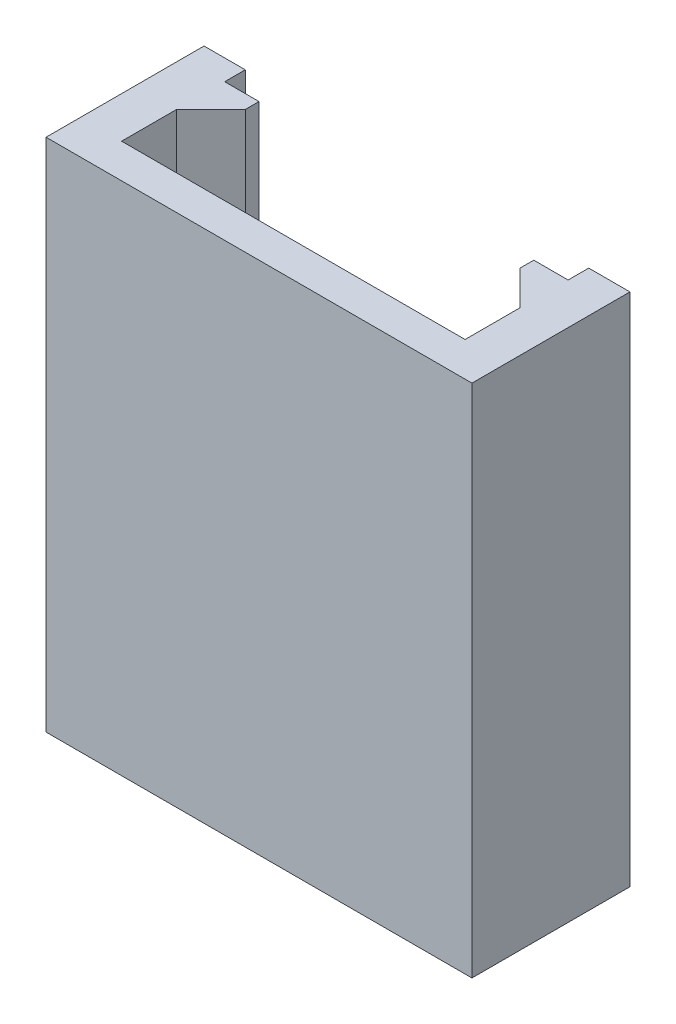
ISO-10303-21;
HEADER;
FILE_DESCRIPTION(('STEP AP214'),'2;1');
FILE_NAME('part.step','',(''),(''),'','','');
FILE_SCHEMA(('AUTOMOTIVE_DESIGN { 1 0 10303 214 1 1 1 1 }'));
ENDSEC;
DATA;
#1=APPLICATION_CONTEXT('core data for automotive mechanical design processes');
#2=APPLICATION_PROTOCOL_DEFINITION('international standard','automotive_design',2000,#1);
#3=PRODUCT_CONTEXT('',#1,'mechanical');
#4=PRODUCT('Part','Part','',(#3));
#5=PRODUCT_RELATED_PRODUCT_CATEGORY('part','',(#4));
#6=PRODUCT_DEFINITION_FORMATION('','',#4);
#7=PRODUCT_DEFINITION_CONTEXT('part definition',#1,'design');
#8=PRODUCT_DEFINITION('design','',#6,#7);
#9=PRODUCT_DEFINITION_SHAPE('','',#8);
#10=(LENGTH_UNIT() NAMED_UNIT(*) SI_UNIT(.MILLI.,.METRE.));
#11=(NAMED_UNIT(*) PLANE_ANGLE_UNIT() SI_UNIT($,.RADIAN.));
#12=(NAMED_UNIT(*) SI_UNIT($,.STERADIAN.) SOLID_ANGLE_UNIT());
#13=UNCERTAINTY_MEASURE_WITH_UNIT(LENGTH_MEASURE(1.E-05),#10,'distance_accuracy_value','');
#14=(GEOMETRIC_REPRESENTATION_CONTEXT(3) GLOBAL_UNCERTAINTY_ASSIGNED_CONTEXT((#13)) GLOBAL_UNIT_ASSIGNED_CONTEXT((#10,
#11,#12)) REPRESENTATION_CONTEXT('',''));
#15=CARTESIAN_POINT('',(0.,0.,0.));
#16=DIRECTION('',(0.,0.,1.));
#17=DIRECTION('',(1.,0.,0.));
#18=AXIS2_PLACEMENT_3D('',#15,#16,#17);
#19=CARTESIAN_POINT('',(-5.,15.,0.));
#20=DIRECTION('',(-1.,0.,0.));
#21=DIRECTION('',(0.,0.,1.));
#22=AXIS2_PLACEMENT_3D('',#19,#20,#21);
#23=PLANE('',#22);
#24=DIRECTION('',(0.,0.,-1.));
#25=VECTOR('',#24,1.);
#26=CARTESIAN_POINT('',(-5.,0.,0.));
#27=LINE('',#26,#25);
#28=CARTESIAN_POINT('',(-5.,0.,0.));
#29=VERTEX_POINT('',#28);
#30=CARTESIAN_POINT('',(-5.,0.,-1.6));
#31=VERTEX_POINT('',#30);
#32=EDGE_CURVE('E177',#29,#31,#27,.T.);
#33=ORIENTED_EDGE('',*,*,#32,.T.);
#34=DIRECTION('',(0.,-1.,0.));
#35=VECTOR('',#34,1.);
#36=CARTESIAN_POINT('',(-5.,15.,-1.6));
#37=LINE('',#36,#35);
#38=CARTESIAN_POINT('',(-5.,15.,-1.6));
#39=VERTEX_POINT('',#38);
#40=EDGE_CURVE('E11',#39,#31,#37,.T.);
#41=ORIENTED_EDGE('',*,*,#40,.F.);
#42=DIRECTION('',(0.,0.,-1.));
#43=VECTOR('',#42,1.);
#44=CARTESIAN_POINT('',(-5.,15.,0.));
#45=LINE('',#44,#43);
#46=CARTESIAN_POINT('',(-5.,15.,0.));
#47=VERTEX_POINT('',#46);
#48=EDGE_CURVE('E207',#47,#39,#45,.T.);
#49=ORIENTED_EDGE('',*,*,#48,.F.);
#50=DIRECTION('',(0.,-1.,0.));
#51=VECTOR('',#50,1.);
#52=CARTESIAN_POINT('',(-5.,15.,0.));
#53=LINE('',#52,#51);
#54=EDGE_CURVE('E173',#47,#29,#53,.T.);
#55=ORIENTED_EDGE('',*,*,#54,.T.);
#56=EDGE_LOOP('',(#33,#41,#49,#55));
#57=FACE_BOUND('',#56,.T.);
#58=ADVANCED_FACE('F33',(#57),#23,.F.);
#59=CARTESIAN_POINT('',(-5.,15.,-1.6));
#60=DIRECTION('',(-0.707106781186547,0.,-0.707106781186548));
#61=DIRECTION('',(-0.707106781186548,0.,0.707106781186547));
#62=AXIS2_PLACEMENT_3D('',#59,#60,#61);
#63=PLANE('',#62);
#64=DIRECTION('',(0.707106781186548,0.,-0.707106781186548));
#65=VECTOR('',#64,1.);
#66=CARTESIAN_POINT('',(-5.,0.,-1.6));
#67=LINE('',#66,#65);
#68=CARTESIAN_POINT('',(-4.,0.,-2.6));
#69=VERTEX_POINT('',#68);
#70=EDGE_CURVE('E180',#31,#69,#67,.T.);
#71=ORIENTED_EDGE('',*,*,#70,.T.);
#72=DIRECTION('',(0.,-1.,0.));
#73=VECTOR('',#72,1.);
#74=CARTESIAN_POINT('',(-4.,15.,-2.6));
#75=LINE('',#74,#73);
#76=CARTESIAN_POINT('',(-4.,15.,-2.6));
#77=VERTEX_POINT('',#76);
#78=EDGE_CURVE('E41',#77,#69,#75,.T.);
#79=ORIENTED_EDGE('',*,*,#78,.F.);
#80=DIRECTION('',(0.707106781186548,0.,-0.707106781186548));
#81=VECTOR('',#80,1.);
#82=CARTESIAN_POINT('',(-5.,15.,-1.6));
#83=LINE('',#82,#81);
#84=EDGE_CURVE('E116',#39,#77,#83,.T.);
#85=ORIENTED_EDGE('',*,*,#84,.F.);
#86=ORIENTED_EDGE('',*,*,#40,.T.);
#87=EDGE_LOOP('',(#71,#79,#85,#86));
#88=FACE_BOUND('',#87,.T.);
#89=ADVANCED_FACE('F305',(#88),#63,.F.);
#90=CARTESIAN_POINT('',(-4.,15.,-2.6));
#91=DIRECTION('',(-1.,0.,0.));
#92=DIRECTION('',(0.,0.,1.));
#93=AXIS2_PLACEMENT_3D('',#90,#91,#92);
#94=PLANE('',#93);
#95=DIRECTION('',(0.,0.,-1.));
#96=VECTOR('',#95,1.);
#97=CARTESIAN_POINT('',(-4.,0.,-2.6));
#98=LINE('',#97,#96);
#99=CARTESIAN_POINT('',(-4.,0.,-3.));
#100=VERTEX_POINT('',#99);
#101=EDGE_CURVE('E182',#69,#100,#98,.T.);
#102=ORIENTED_EDGE('',*,*,#101,.T.);
#103=DIRECTION('',(0.,-1.,0.));
#104=VECTOR('',#103,1.);
#105=CARTESIAN_POINT('',(-4.,15.,-3.));
#106=LINE('',#105,#104);
#107=CARTESIAN_POINT('',(-4.,15.,-3.));
#108=VERTEX_POINT('',#107);
#109=EDGE_CURVE('E238',#108,#100,#106,.T.);
#110=ORIENTED_EDGE('',*,*,#109,.F.);
#111=DIRECTION('',(0.,0.,-1.));
#112=VECTOR('',#111,1.);
#113=CARTESIAN_POINT('',(-4.,15.,-2.6));
#114=LINE('',#113,#112);
#115=EDGE_CURVE('E246',#77,#108,#114,.T.);
#116=ORIENTED_EDGE('',*,*,#115,.F.);
#117=ORIENTED_EDGE('',*,*,#78,.T.);
#118=EDGE_LOOP('',(#102,#110,#116,#117));
#119=FACE_BOUND('',#118,.T.);
#120=ADVANCED_FACE('F244',(#119),#94,.F.);
#121=CARTESIAN_POINT('',(-4.,15.,-3.));
#122=DIRECTION('',(0.,0.,1.));
#123=DIRECTION('',(1.,0.,0.));
#124=AXIS2_PLACEMENT_3D('',#121,#122,#123);
#125=PLANE('',#124);
#126=DIRECTION('',(-1.,0.,0.));
#127=VECTOR('',#126,1.);
#128=CARTESIAN_POINT('',(-4.,0.,-3.));
#129=LINE('',#128,#127);
#130=CARTESIAN_POINT('',(-5.,0.,-3.));
#131=VERTEX_POINT('',#130);
#132=EDGE_CURVE('E184',#100,#131,#129,.T.);
#133=ORIENTED_EDGE('',*,*,#132,.T.);
#134=DIRECTION('',(0.,-1.,0.));
#135=VECTOR('',#134,1.);
#136=CARTESIAN_POINT('',(-5.,15.,-3.));
#137=LINE('',#136,#135);
#138=CARTESIAN_POINT('',(-5.,15.,-3.));
#139=VERTEX_POINT('',#138);
#140=EDGE_CURVE('E235',#139,#131,#137,.T.);
#141=ORIENTED_EDGE('',*,*,#140,.F.);
#142=DIRECTION('',(-1.,0.,0.));
#143=VECTOR('',#142,1.);
#144=CARTESIAN_POINT('',(-4.,15.,-3.));
#145=LINE('',#144,#143);
#146=EDGE_CURVE('E264',#108,#139,#145,.T.);
#147=ORIENTED_EDGE('',*,*,#146,.F.);
#148=ORIENTED_EDGE('',*,*,#109,.T.);
#149=EDGE_LOOP('',(#133,#141,#147,#148));
#150=FACE_BOUND('',#149,.T.);
#151=ADVANCED_FACE('F255',(#150),#125,.F.);
#152=CARTESIAN_POINT('',(-5.,15.,-3.));
#153=DIRECTION('',(-1.,0.,0.));
#154=DIRECTION('',(0.,0.,1.));
#155=AXIS2_PLACEMENT_3D('',#152,#153,#154);
#156=PLANE('',#155);
#157=DIRECTION('',(0.,0.,-1.));
#158=VECTOR('',#157,1.);
#159=CARTESIAN_POINT('',(-5.,0.,-3.));
#160=LINE('',#159,#158);
#161=CARTESIAN_POINT('',(-5.,0.,-3.6));
#162=VERTEX_POINT('',#161);
#163=EDGE_CURVE('E186',#131,#162,#160,.T.);
#164=ORIENTED_EDGE('',*,*,#163,.T.);
#165=DIRECTION('',(0.,-1.,0.));
#166=VECTOR('',#165,1.);
#167=CARTESIAN_POINT('',(-5.,15.,-3.6));
#168=LINE('',#167,#166);
#169=CARTESIAN_POINT('',(-5.,15.,-3.6));
#170=VERTEX_POINT('',#169);
#171=EDGE_CURVE('E232',#170,#162,#168,.T.);
#172=ORIENTED_EDGE('',*,*,#171,.F.);
#173=DIRECTION('',(0.,0.,-1.));
#174=VECTOR('',#173,1.);
#175=CARTESIAN_POINT('',(-5.,15.,-3.));
#176=LINE('',#175,#174);
#177=EDGE_CURVE('E261',#139,#170,#176,.T.);
#178=ORIENTED_EDGE('',*,*,#177,.F.);
#179=ORIENTED_EDGE('',*,*,#140,.T.);
#180=EDGE_LOOP('',(#164,#172,#178,#179));
#181=FACE_BOUND('',#180,.T.);
#182=ADVANCED_FACE('F259',(#181),#156,.F.);
#183=CARTESIAN_POINT('',(-5.,15.,-3.6));
#184=DIRECTION('',(0.,0.,1.));
#185=DIRECTION('',(1.,0.,0.));
#186=AXIS2_PLACEMENT_3D('',#183,#184,#185);
#187=PLANE('',#186);
#188=DIRECTION('',(-1.,0.,0.));
#189=VECTOR('',#188,1.);
#190=CARTESIAN_POINT('',(-5.,0.,-3.6));
#191=LINE('',#190,#189);
#192=CARTESIAN_POINT('',(-6.2,0.,-3.6));
#193=VERTEX_POINT('',#192);
#194=EDGE_CURVE('E188',#162,#193,#191,.T.);
#195=ORIENTED_EDGE('',*,*,#194,.T.);
#196=DIRECTION('',(0.,-1.,0.));
#197=VECTOR('',#196,1.);
#198=CARTESIAN_POINT('',(-6.2,15.,-3.6));
#199=LINE('',#198,#197);
#200=CARTESIAN_POINT('',(-6.2,15.,-3.6));
#201=VERTEX_POINT('',#200);
#202=EDGE_CURVE('E229',#201,#193,#199,.T.);
#203=ORIENTED_EDGE('',*,*,#202,.F.);
#204=DIRECTION('',(-1.,0.,0.));
#205=VECTOR('',#204,1.);
#206=CARTESIAN_POINT('',(-5.,15.,-3.6));
#207=LINE('',#206,#205);
#208=EDGE_CURVE('E263',#170,#201,#207,.T.);
#209=ORIENTED_EDGE('',*,*,#208,.F.);
#210=ORIENTED_EDGE('',*,*,#171,.T.);
#211=EDGE_LOOP('',(#195,#203,#209,#210));
#212=FACE_BOUND('',#211,.T.);
#213=ADVANCED_FACE('F318',(#212),#187,.F.);
#214=CARTESIAN_POINT('',(-6.2,15.,-3.6));
#215=DIRECTION('',(1.,0.,0.));
#216=DIRECTION('',(0.,0.,-1.));
#217=AXIS2_PLACEMENT_3D('',#214,#215,#216);
#218=PLANE('',#217);
#219=DIRECTION('',(0.,0.,1.));
#220=VECTOR('',#219,1.);
#221=CARTESIAN_POINT('',(-6.2,0.,-3.6));
#222=LINE('',#221,#220);
#223=CARTESIAN_POINT('',(-6.2,0.,1.));
#224=VERTEX_POINT('',#223);
#225=EDGE_CURVE('E190',#193,#224,#222,.T.);
#226=ORIENTED_EDGE('',*,*,#225,.T.);
#227=DIRECTION('',(0.,-1.,0.));
#228=VECTOR('',#227,1.);
#229=CARTESIAN_POINT('',(-6.2,15.,1.));
#230=LINE('',#229,#228);
#231=CARTESIAN_POINT('',(-6.2,15.,1.));
#232=VERTEX_POINT('',#231);
#233=EDGE_CURVE('E226',#232,#224,#230,.T.);
#234=ORIENTED_EDGE('',*,*,#233,.F.);
#235=DIRECTION('',(0.,0.,1.));
#236=VECTOR('',#235,1.);
#237=CARTESIAN_POINT('',(-6.2,15.,-3.6));
#238=LINE('',#237,#236);
#239=EDGE_CURVE('E266',#201,#232,#238,.T.);
#240=ORIENTED_EDGE('',*,*,#239,.F.);
#241=ORIENTED_EDGE('',*,*,#202,.T.);
#242=EDGE_LOOP('',(#226,#234,#240,#241));
#243=FACE_BOUND('',#242,.T.);
#244=ADVANCED_FACE('F321',(#243),#218,.F.);
#245=CARTESIAN_POINT('',(-6.2,15.,1.));
#246=DIRECTION('',(0.,0.,-1.));
#247=DIRECTION('',(-1.,0.,0.));
#248=AXIS2_PLACEMENT_3D('',#245,#246,#247);
#249=PLANE('',#248);
#250=DIRECTION('',(1.,0.,0.));
#251=VECTOR('',#250,1.);
#252=CARTESIAN_POINT('',(-6.2,0.,1.));
#253=LINE('',#252,#251);
#254=CARTESIAN_POINT('',(6.20000000000001,0.,1.));
#255=VERTEX_POINT('',#254);
#256=EDGE_CURVE('E192',#224,#255,#253,.T.);
#257=ORIENTED_EDGE('',*,*,#256,.T.);
#258=DIRECTION('',(0.,-1.,0.));
#259=VECTOR('',#258,1.);
#260=CARTESIAN_POINT('',(6.20000000000001,15.,1.));
#261=LINE('',#260,#259);
#262=CARTESIAN_POINT('',(6.20000000000001,15.,1.));
#263=VERTEX_POINT('',#262);
#264=EDGE_CURVE('E223',#263,#255,#261,.T.);
#265=ORIENTED_EDGE('',*,*,#264,.F.);
#266=DIRECTION('',(1.,0.,0.));
#267=VECTOR('',#266,1.);
#268=CARTESIAN_POINT('',(-6.2,15.,1.));
#269=LINE('',#268,#267);
#270=EDGE_CURVE('E272',#232,#263,#269,.T.);
#271=ORIENTED_EDGE('',*,*,#270,.F.);
#272=ORIENTED_EDGE('',*,*,#233,.T.);
#273=EDGE_LOOP('',(#257,#265,#271,#272));
#274=FACE_BOUND('',#273,.T.);
#275=ADVANCED_FACE('F325',(#274),#249,.F.);
#276=CARTESIAN_POINT('',(6.2,15.,-3.6));
#277=DIRECTION('',(-1.,0.,0.));
#278=DIRECTION('',(0.,0.,1.));
#279=AXIS2_PLACEMENT_3D('',#276,#277,#278);
#280=PLANE('',#279);
#281=DIRECTION('',(0.,0.,-1.));
#282=VECTOR('',#281,1.);
#283=CARTESIAN_POINT('',(6.2,0.,-3.6));
#284=LINE('',#283,#282);
#285=CARTESIAN_POINT('',(6.2,0.,-3.6));
#286=VERTEX_POINT('',#285);
#287=EDGE_CURVE('E194',#255,#286,#284,.T.);
#288=ORIENTED_EDGE('',*,*,#287,.T.);
#289=DIRECTION('',(0.,-1.,0.));
#290=VECTOR('',#289,1.);
#291=CARTESIAN_POINT('',(6.2,15.,-3.6));
#292=LINE('',#291,#290);
#293=CARTESIAN_POINT('',(6.2,15.,-3.6));
#294=VERTEX_POINT('',#293);
#295=EDGE_CURVE('E220',#294,#286,#292,.T.);
#296=ORIENTED_EDGE('',*,*,#295,.F.);
#297=DIRECTION('',(0.,0.,-1.));
#298=VECTOR('',#297,1.);
#299=CARTESIAN_POINT('',(6.2,15.,-3.6));
#300=LINE('',#299,#298);
#301=EDGE_CURVE('E274',#263,#294,#300,.T.);
#302=ORIENTED_EDGE('',*,*,#301,.F.);
#303=ORIENTED_EDGE('',*,*,#264,.T.);
#304=EDGE_LOOP('',(#288,#296,#302,#303));
#305=FACE_BOUND('',#304,.T.);
#306=ADVANCED_FACE('F329',(#305),#280,.F.);
#307=CARTESIAN_POINT('',(5.,15.,-3.6));
#308=DIRECTION('',(0.,0.,1.));
#309=DIRECTION('',(1.,0.,0.));
#310=AXIS2_PLACEMENT_3D('',#307,#308,#309);
#311=PLANE('',#310);
#312=DIRECTION('',(-1.,0.,0.));
#313=VECTOR('',#312,1.);
#314=CARTESIAN_POINT('',(5.,0.,-3.6));
#315=LINE('',#314,#313);
#316=CARTESIAN_POINT('',(5.,0.,-3.6));
#317=VERTEX_POINT('',#316);
#318=EDGE_CURVE('E196',#286,#317,#315,.T.);
#319=ORIENTED_EDGE('',*,*,#318,.T.);
#320=DIRECTION('',(0.,-1.,0.));
#321=VECTOR('',#320,1.);
#322=CARTESIAN_POINT('',(5.,15.,-3.6));
#323=LINE('',#322,#321);
#324=CARTESIAN_POINT('',(5.,15.,-3.6));
#325=VERTEX_POINT('',#324);
#326=EDGE_CURVE('E217',#325,#317,#323,.T.);
#327=ORIENTED_EDGE('',*,*,#326,.F.);
#328=DIRECTION('',(-1.,0.,0.));
#329=VECTOR('',#328,1.);
#330=CARTESIAN_POINT('',(5.,15.,-3.6));
#331=LINE('',#330,#329);
#332=EDGE_CURVE('E276',#294,#325,#331,.T.);
#333=ORIENTED_EDGE('',*,*,#332,.F.);
#334=ORIENTED_EDGE('',*,*,#295,.T.);
#335=EDGE_LOOP('',(#319,#327,#333,#334));
#336=FACE_BOUND('',#335,.T.);
#337=ADVANCED_FACE('F333',(#336),#311,.F.);
#338=CARTESIAN_POINT('',(5.,15.,-3.));
#339=DIRECTION('',(1.,0.,0.));
#340=DIRECTION('',(0.,0.,-1.));
#341=AXIS2_PLACEMENT_3D('',#338,#339,#340);
#342=PLANE('',#341);
#343=DIRECTION('',(0.,0.,1.));
#344=VECTOR('',#343,1.);
#345=CARTESIAN_POINT('',(5.,0.,-3.));
#346=LINE('',#345,#344);
#347=CARTESIAN_POINT('',(5.,0.,-3.));
#348=VERTEX_POINT('',#347);
#349=EDGE_CURVE('E198',#317,#348,#346,.T.);
#350=ORIENTED_EDGE('',*,*,#349,.T.);
#351=DIRECTION('',(0.,-1.,0.));
#352=VECTOR('',#351,1.);
#353=CARTESIAN_POINT('',(5.,15.,-3.));
#354=LINE('',#353,#352);
#355=CARTESIAN_POINT('',(5.,15.,-3.));
#356=VERTEX_POINT('',#355);
#357=EDGE_CURVE('E214',#356,#348,#354,.T.);
#358=ORIENTED_EDGE('',*,*,#357,.F.);
#359=DIRECTION('',(0.,0.,1.));
#360=VECTOR('',#359,1.);
#361=CARTESIAN_POINT('',(5.,15.,-3.));
#362=LINE('',#361,#360);
#363=EDGE_CURVE('E278',#325,#356,#362,.T.);
#364=ORIENTED_EDGE('',*,*,#363,.F.);
#365=ORIENTED_EDGE('',*,*,#326,.T.);
#366=EDGE_LOOP('',(#350,#358,#364,#365));
#367=FACE_BOUND('',#366,.T.);
#368=ADVANCED_FACE('F337',(#367),#342,.F.);
#369=CARTESIAN_POINT('',(4.,15.,-3.));
#370=DIRECTION('',(0.,0.,1.));
#371=DIRECTION('',(1.,0.,0.));
#372=AXIS2_PLACEMENT_3D('',#369,#370,#371);
#373=PLANE('',#372);
#374=DIRECTION('',(-1.,0.,0.));
#375=VECTOR('',#374,1.);
#376=CARTESIAN_POINT('',(4.,0.,-3.));
#377=LINE('',#376,#375);
#378=CARTESIAN_POINT('',(4.,0.,-3.));
#379=VERTEX_POINT('',#378);
#380=EDGE_CURVE('E200',#348,#379,#377,.T.);
#381=ORIENTED_EDGE('',*,*,#380,.T.);
#382=DIRECTION('',(0.,-1.,0.));
#383=VECTOR('',#382,1.);
#384=CARTESIAN_POINT('',(4.,15.,-3.));
#385=LINE('',#384,#383);
#386=CARTESIAN_POINT('',(4.,15.,-3.));
#387=VERTEX_POINT('',#386);
#388=EDGE_CURVE('E211',#387,#379,#385,.T.);
#389=ORIENTED_EDGE('',*,*,#388,.F.);
#390=DIRECTION('',(-1.,0.,0.));
#391=VECTOR('',#390,1.);
#392=CARTESIAN_POINT('',(4.,15.,-3.));
#393=LINE('',#392,#391);
#394=EDGE_CURVE('E280',#356,#387,#393,.T.);
#395=ORIENTED_EDGE('',*,*,#394,.F.);
#396=ORIENTED_EDGE('',*,*,#357,.T.);
#397=EDGE_LOOP('',(#381,#389,#395,#396));
#398=FACE_BOUND('',#397,.T.);
#399=ADVANCED_FACE('F286',(#398),#373,.F.);
#400=CARTESIAN_POINT('',(4.,15.,-2.6));
#401=DIRECTION('',(1.,0.,0.));
#402=DIRECTION('',(0.,0.,-1.));
#403=AXIS2_PLACEMENT_3D('',#400,#401,#402);
#404=PLANE('',#403);
#405=DIRECTION('',(0.,0.,1.));
#406=VECTOR('',#405,1.);
#407=CARTESIAN_POINT('',(4.,0.,-2.6));
#408=LINE('',#407,#406);
#409=CARTESIAN_POINT('',(4.,0.,-2.6));
#410=VERTEX_POINT('',#409);
#411=EDGE_CURVE('E202',#379,#410,#408,.T.);
#412=ORIENTED_EDGE('',*,*,#411,.T.);
#413=DIRECTION('',(0.,-1.,0.));
#414=VECTOR('',#413,1.);
#415=CARTESIAN_POINT('',(4.,15.,-2.6));
#416=LINE('',#415,#414);
#417=CARTESIAN_POINT('',(4.,15.,-2.6));
#418=VERTEX_POINT('',#417);
#419=EDGE_CURVE('E168',#418,#410,#416,.T.);
#420=ORIENTED_EDGE('',*,*,#419,.F.);
#421=DIRECTION('',(0.,0.,1.));
#422=VECTOR('',#421,1.);
#423=CARTESIAN_POINT('',(4.,15.,-2.6));
#424=LINE('',#423,#422);
#425=EDGE_CURVE('E159',#387,#418,#424,.T.);
#426=ORIENTED_EDGE('',*,*,#425,.F.);
#427=ORIENTED_EDGE('',*,*,#388,.T.);
#428=EDGE_LOOP('',(#412,#420,#426,#427));
#429=FACE_BOUND('',#428,.T.);
#430=ADVANCED_FACE('F290',(#429),#404,.F.);
#431=CARTESIAN_POINT('',(5.,15.,-1.6));
#432=DIRECTION('',(0.707106781186547,0.,-0.707106781186548));
#433=DIRECTION('',(-0.707106781186548,0.,-0.707106781186547));
#434=AXIS2_PLACEMENT_3D('',#431,#432,#433);
#435=PLANE('',#434);
#436=DIRECTION('',(0.707106781186548,0.,0.707106781186548));
#437=VECTOR('',#436,1.);
#438=CARTESIAN_POINT('',(5.,0.,-1.6));
#439=LINE('',#438,#437);
#440=CARTESIAN_POINT('',(5.,0.,-1.6));
#441=VERTEX_POINT('',#440);
#442=EDGE_CURVE('E167',#410,#441,#439,.T.);
#443=ORIENTED_EDGE('',*,*,#442,.T.);
#444=DIRECTION('',(0.,-1.,0.));
#445=VECTOR('',#444,1.);
#446=CARTESIAN_POINT('',(5.,15.,-1.6));
#447=LINE('',#446,#445);
#448=CARTESIAN_POINT('',(5.,15.,-1.6));
#449=VERTEX_POINT('',#448);
#450=EDGE_CURVE('E164',#449,#441,#447,.T.);
#451=ORIENTED_EDGE('',*,*,#450,.F.);
#452=DIRECTION('',(0.707106781186548,0.,0.707106781186548));
#453=VECTOR('',#452,1.);
#454=CARTESIAN_POINT('',(5.,15.,-1.6));
#455=LINE('',#454,#453);
#456=EDGE_CURVE('E153',#418,#449,#455,.T.);
#457=ORIENTED_EDGE('',*,*,#456,.F.);
#458=ORIENTED_EDGE('',*,*,#419,.T.);
#459=EDGE_LOOP('',(#443,#451,#457,#458));
#460=FACE_BOUND('',#459,.T.);
#461=ADVANCED_FACE('F165',(#460),#435,.F.);
#462=CARTESIAN_POINT('',(5.,15.,0.));
#463=DIRECTION('',(1.,0.,0.));
#464=DIRECTION('',(0.,0.,-1.));
#465=AXIS2_PLACEMENT_3D('',#462,#463,#464);
#466=PLANE('',#465);
#467=DIRECTION('',(0.,0.,1.));
#468=VECTOR('',#467,1.);
#469=CARTESIAN_POINT('',(5.,0.,0.));
#470=LINE('',#469,#468);
#471=CARTESIAN_POINT('',(5.,0.,0.));
#472=VERTEX_POINT('',#471);
#473=EDGE_CURVE('E102',#441,#472,#470,.T.);
#474=ORIENTED_EDGE('',*,*,#473,.T.);
#475=DIRECTION('',(0.,-1.,0.));
#476=VECTOR('',#475,1.);
#477=CARTESIAN_POINT('',(5.,15.,0.));
#478=LINE('',#477,#476);
#479=CARTESIAN_POINT('',(5.,15.,0.));
#480=VERTEX_POINT('',#479);
#481=EDGE_CURVE('E169',#480,#472,#478,.T.);
#482=ORIENTED_EDGE('',*,*,#481,.F.);
#483=DIRECTION('',(0.,0.,1.));
#484=VECTOR('',#483,1.);
#485=CARTESIAN_POINT('',(5.,15.,0.));
#486=LINE('',#485,#484);
#487=EDGE_CURVE('E157',#449,#480,#486,.T.);
#488=ORIENTED_EDGE('',*,*,#487,.F.);
#489=ORIENTED_EDGE('',*,*,#450,.T.);
#490=EDGE_LOOP('',(#474,#482,#488,#489));
#491=FACE_BOUND('',#490,.T.);
#492=ADVANCED_FACE('F171',(#491),#466,.F.);
#493=CARTESIAN_POINT('',(-5.,15.,0.));
#494=DIRECTION('',(0.,0.,1.));
#495=DIRECTION('',(1.,0.,0.));
#496=AXIS2_PLACEMENT_3D('',#493,#494,#495);
#497=PLANE('',#496);
#498=DIRECTION('',(-1.,0.,0.));
#499=VECTOR('',#498,1.);
#500=CARTESIAN_POINT('',(-5.,0.,0.));
#501=LINE('',#500,#499);
#502=EDGE_CURVE('E108',#472,#29,#501,.T.);
#503=ORIENTED_EDGE('',*,*,#502,.T.);
#504=ORIENTED_EDGE('',*,*,#54,.F.);
#505=DIRECTION('',(-1.,0.,0.));
#506=VECTOR('',#505,1.);
#507=CARTESIAN_POINT('',(-5.,15.,0.));
#508=LINE('',#507,#506);
#509=EDGE_CURVE('E49',#480,#47,#508,.T.);
#510=ORIENTED_EDGE('',*,*,#509,.F.);
#511=ORIENTED_EDGE('',*,*,#481,.T.);
#512=EDGE_LOOP('',(#503,#504,#510,#511));
#513=FACE_BOUND('',#512,.T.);
#514=ADVANCED_FACE('F294',(#513),#497,.F.);
#515=CARTESIAN_POINT('',(0.,15.,0.));
#516=DIRECTION('',(0.,1.,0.));
#517=DIRECTION('',(0.,0.,1.));
#518=AXIS2_PLACEMENT_3D('',#515,#516,#517);
#519=PLANE('',#518);
#520=ORIENTED_EDGE('',*,*,#48,.T.);
#521=ORIENTED_EDGE('',*,*,#84,.T.);
#522=ORIENTED_EDGE('',*,*,#115,.T.);
#523=ORIENTED_EDGE('',*,*,#146,.T.);
#524=ORIENTED_EDGE('',*,*,#177,.T.);
#525=ORIENTED_EDGE('',*,*,#208,.T.);
#526=ORIENTED_EDGE('',*,*,#239,.T.);
#527=ORIENTED_EDGE('',*,*,#270,.T.);
#528=ORIENTED_EDGE('',*,*,#301,.T.);
#529=ORIENTED_EDGE('',*,*,#332,.T.);
#530=ORIENTED_EDGE('',*,*,#363,.T.);
#531=ORIENTED_EDGE('',*,*,#394,.T.);
#532=ORIENTED_EDGE('',*,*,#425,.T.);
#533=ORIENTED_EDGE('',*,*,#456,.T.);
#534=ORIENTED_EDGE('',*,*,#487,.T.);
#535=ORIENTED_EDGE('',*,*,#509,.T.);
#536=EDGE_LOOP('',(#520,#521,#522,#523,#524,#525,#526,#527,#528,#529,#530,#531,#532,#533,#534,#535));
#537=FACE_BOUND('',#536,.T.);
#538=ADVANCED_FACE('F155',(#537),#519,.T.);
#539=CARTESIAN_POINT('',(0.,0.,0.));
#540=DIRECTION('',(0.,1.,0.));
#541=DIRECTION('',(0.,0.,1.));
#542=AXIS2_PLACEMENT_3D('',#539,#540,#541);
#543=PLANE('',#542);
#544=ORIENTED_EDGE('',*,*,#32,.F.);
#545=ORIENTED_EDGE('',*,*,#502,.F.);
#546=ORIENTED_EDGE('',*,*,#473,.F.);
#547=ORIENTED_EDGE('',*,*,#442,.F.);
#548=ORIENTED_EDGE('',*,*,#411,.F.);
#549=ORIENTED_EDGE('',*,*,#380,.F.);
#550=ORIENTED_EDGE('',*,*,#349,.F.);
#551=ORIENTED_EDGE('',*,*,#318,.F.);
#552=ORIENTED_EDGE('',*,*,#287,.F.);
#553=ORIENTED_EDGE('',*,*,#256,.F.);
#554=ORIENTED_EDGE('',*,*,#225,.F.);
#555=ORIENTED_EDGE('',*,*,#194,.F.);
#556=ORIENTED_EDGE('',*,*,#163,.F.);
#557=ORIENTED_EDGE('',*,*,#132,.F.);
#558=ORIENTED_EDGE('',*,*,#101,.F.);
#559=ORIENTED_EDGE('',*,*,#70,.F.);
#560=EDGE_LOOP('',(#544,#545,#546,#547,#548,#549,#550,#551,#552,#553,#554,#555,#556,#557,#558,#559));
#561=FACE_BOUND('',#560,.T.);
#562=ADVANCED_FACE('F250',(#561),#543,.F.);
#563=CLOSED_SHELL('',(#58,#89,#120,#151,#182,#213,#244,#275,#306,#337,#368,#399,#430,#461,#492,
#514,#538,#562));
#564=MANIFOLD_SOLID_BREP('B2',#563);
#565=ADVANCED_BREP_SHAPE_REPRESENTATION('',(#18,#564),#14);
#566=SHAPE_DEFINITION_REPRESENTATION(#9,#565);
ENDSEC;
END-ISO-10303-21;
